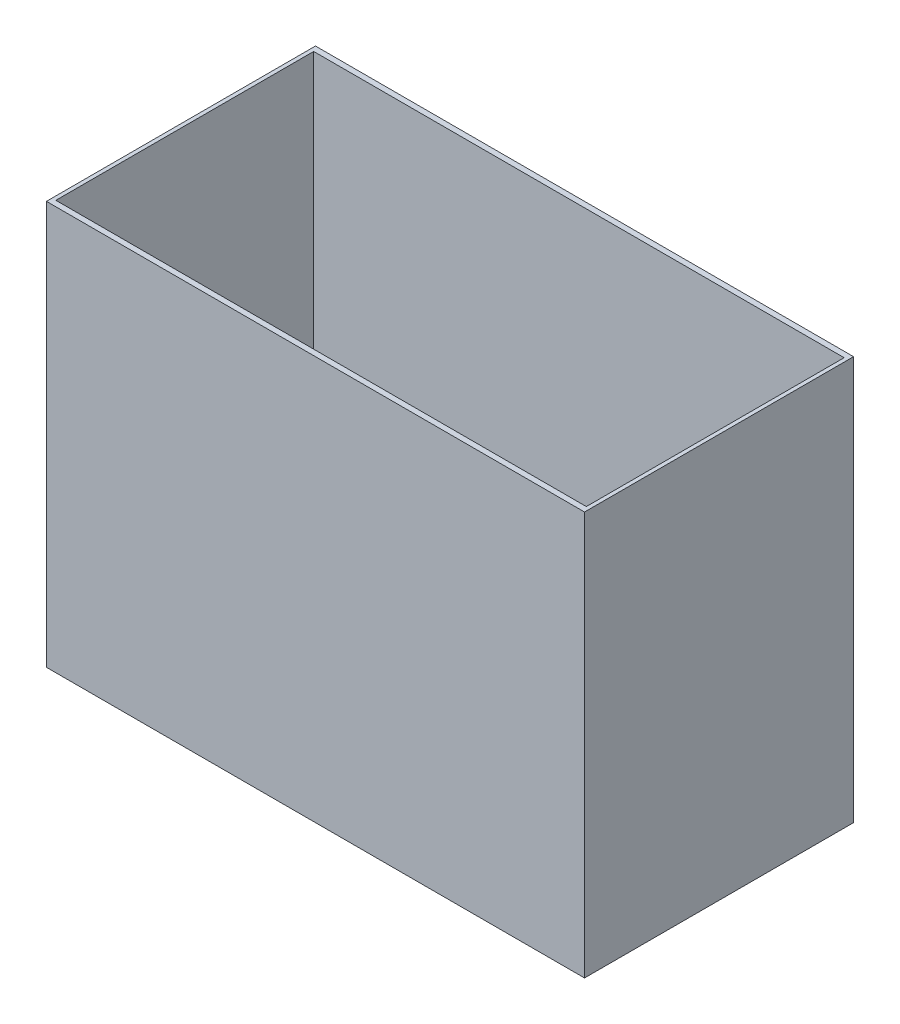
ISO-10303-21;
HEADER;
FILE_DESCRIPTION(('STEP AP214'),'2;1');
FILE_NAME('part.step','',(''),(''),'','','');
FILE_SCHEMA(('AUTOMOTIVE_DESIGN { 1 0 10303 214 1 1 1 1 }'));
ENDSEC;
DATA;
#1=APPLICATION_CONTEXT('core data for automotive mechanical design processes');
#2=APPLICATION_PROTOCOL_DEFINITION('international standard','automotive_design',2000,#1);
#3=PRODUCT_CONTEXT('',#1,'mechanical');
#4=PRODUCT('Part','Part','',(#3));
#5=PRODUCT_RELATED_PRODUCT_CATEGORY('part','',(#4));
#6=PRODUCT_DEFINITION_FORMATION('','',#4);
#7=PRODUCT_DEFINITION_CONTEXT('part definition',#1,'design');
#8=PRODUCT_DEFINITION('design','',#6,#7);
#9=PRODUCT_DEFINITION_SHAPE('','',#8);
#10=(LENGTH_UNIT() NAMED_UNIT(*) SI_UNIT(.MILLI.,.METRE.));
#11=(NAMED_UNIT(*) PLANE_ANGLE_UNIT() SI_UNIT($,.RADIAN.));
#12=(NAMED_UNIT(*) SI_UNIT($,.STERADIAN.) SOLID_ANGLE_UNIT());
#13=UNCERTAINTY_MEASURE_WITH_UNIT(LENGTH_MEASURE(1.E-05),#10,'distance_accuracy_value','');
#14=(GEOMETRIC_REPRESENTATION_CONTEXT(3) GLOBAL_UNCERTAINTY_ASSIGNED_CONTEXT((#13)) GLOBAL_UNIT_ASSIGNED_CONTEXT((#10,
#11,#12)) REPRESENTATION_CONTEXT('',''));
#15=CARTESIAN_POINT('',(0.,0.,0.));
#16=DIRECTION('',(0.,0.,1.));
#17=DIRECTION('',(1.,0.,0.));
#18=AXIS2_PLACEMENT_3D('',#15,#16,#17);
#19=CARTESIAN_POINT('',(0.,457.2,0.));
#20=DIRECTION('',(0.,-1.,0.));
#21=DIRECTION('',(0.,0.,-1.));
#22=AXIS2_PLACEMENT_3D('',#19,#20,#21);
#23=PLANE('',#22);
#24=DIRECTION('',(0.,0.,-1.));
#25=VECTOR('',#24,1.);
#26=CARTESIAN_POINT('',(304.8,457.2,152.4));
#27=LINE('',#26,#25);
#28=CARTESIAN_POINT('',(304.8,457.2,152.4));
#29=VERTEX_POINT('',#28);
#30=CARTESIAN_POINT('',(304.8,457.2,-152.4));
#31=VERTEX_POINT('',#30);
#32=EDGE_CURVE('E151',#29,#31,#27,.T.);
#33=ORIENTED_EDGE('',*,*,#32,.T.);
#34=DIRECTION('',(-1.,0.,0.));
#35=VECTOR('',#34,1.);
#36=CARTESIAN_POINT('',(-304.8,457.2,-152.4));
#37=LINE('',#36,#35);
#38=CARTESIAN_POINT('',(-304.8,457.2,-152.4));
#39=VERTEX_POINT('',#38);
#40=EDGE_CURVE('E154',#31,#39,#37,.T.);
#41=ORIENTED_EDGE('',*,*,#40,.T.);
#42=DIRECTION('',(0.,0.,1.));
#43=VECTOR('',#42,1.);
#44=CARTESIAN_POINT('',(-304.8,457.2,152.4));
#45=LINE('',#44,#43);
#46=CARTESIAN_POINT('',(-304.8,457.2,152.4));
#47=VERTEX_POINT('',#46);
#48=EDGE_CURVE('E157',#39,#47,#45,.T.);
#49=ORIENTED_EDGE('',*,*,#48,.T.);
#50=DIRECTION('',(1.,0.,0.));
#51=VECTOR('',#50,1.);
#52=CARTESIAN_POINT('',(-304.8,457.2,152.4));
#53=LINE('',#52,#51);
#54=EDGE_CURVE('E159',#47,#29,#53,.T.);
#55=ORIENTED_EDGE('',*,*,#54,.T.);
#56=EDGE_LOOP('',(#33,#41,#49,#55));
#57=FACE_BOUND('',#56,.T.);
#58=DIRECTION('',(0.,0.,-1.));
#59=VECTOR('',#58,1.);
#60=CARTESIAN_POINT('',(300.482,457.2,146.05));
#61=LINE('',#60,#59);
#62=CARTESIAN_POINT('',(300.482,457.2,146.05));
#63=VERTEX_POINT('',#62);
#64=CARTESIAN_POINT('',(300.482,457.2,-146.05));
#65=VERTEX_POINT('',#64);
#66=EDGE_CURVE('E115',#63,#65,#61,.T.);
#67=ORIENTED_EDGE('',*,*,#66,.F.);
#68=DIRECTION('',(1.,0.,0.));
#69=VECTOR('',#68,1.);
#70=CARTESIAN_POINT('',(-300.482,457.2,146.05));
#71=LINE('',#70,#69);
#72=CARTESIAN_POINT('',(-300.482,457.2,146.05));
#73=VERTEX_POINT('',#72);
#74=EDGE_CURVE('E137',#73,#63,#71,.T.);
#75=ORIENTED_EDGE('',*,*,#74,.F.);
#76=DIRECTION('',(0.,0.,1.));
#77=VECTOR('',#76,1.);
#78=CARTESIAN_POINT('',(-300.482,457.2,146.05));
#79=LINE('',#78,#77);
#80=CARTESIAN_POINT('',(-300.482,457.2,-146.05));
#81=VERTEX_POINT('',#80);
#82=EDGE_CURVE('E135',#81,#73,#79,.T.);
#83=ORIENTED_EDGE('',*,*,#82,.F.);
#84=DIRECTION('',(-1.,0.,0.));
#85=VECTOR('',#84,1.);
#86=CARTESIAN_POINT('',(-300.482,457.2,-146.05));
#87=LINE('',#86,#85);
#88=EDGE_CURVE('E123',#65,#81,#87,.T.);
#89=ORIENTED_EDGE('',*,*,#88,.F.);
#90=EDGE_LOOP('',(#67,#75,#83,#89));
#91=FACE_BOUND('',#90,.T.);
#92=ADVANCED_FACE('F50',(#57,#91),#23,.F.);
#93=CARTESIAN_POINT('',(0.,0.,0.));
#94=DIRECTION('',(0.,-1.,0.));
#95=DIRECTION('',(0.,0.,-1.));
#96=AXIS2_PLACEMENT_3D('',#93,#94,#95);
#97=PLANE('',#96);
#98=DIRECTION('',(0.,0.,-1.));
#99=VECTOR('',#98,1.);
#100=CARTESIAN_POINT('',(304.8,0.,152.4));
#101=LINE('',#100,#99);
#102=CARTESIAN_POINT('',(304.8,0.,152.4));
#103=VERTEX_POINT('',#102);
#104=CARTESIAN_POINT('',(304.8,0.,-152.4));
#105=VERTEX_POINT('',#104);
#106=EDGE_CURVE('E131',#103,#105,#101,.T.);
#107=ORIENTED_EDGE('',*,*,#106,.F.);
#108=DIRECTION('',(1.,0.,0.));
#109=VECTOR('',#108,1.);
#110=CARTESIAN_POINT('',(-304.8,0.,152.4));
#111=LINE('',#110,#109);
#112=CARTESIAN_POINT('',(-304.8,0.,152.4));
#113=VERTEX_POINT('',#112);
#114=EDGE_CURVE('E155',#113,#103,#111,.T.);
#115=ORIENTED_EDGE('',*,*,#114,.F.);
#116=DIRECTION('',(0.,0.,1.));
#117=VECTOR('',#116,1.);
#118=CARTESIAN_POINT('',(-304.8,0.,152.4));
#119=LINE('',#118,#117);
#120=CARTESIAN_POINT('',(-304.8,0.,-152.4));
#121=VERTEX_POINT('',#120);
#122=EDGE_CURVE('E166',#121,#113,#119,.T.);
#123=ORIENTED_EDGE('',*,*,#122,.F.);
#124=DIRECTION('',(-1.,0.,0.));
#125=VECTOR('',#124,1.);
#126=CARTESIAN_POINT('',(-304.8,0.,-152.4));
#127=LINE('',#126,#125);
#128=EDGE_CURVE('E164',#105,#121,#127,.T.);
#129=ORIENTED_EDGE('',*,*,#128,.F.);
#130=EDGE_LOOP('',(#107,#115,#123,#129));
#131=FACE_BOUND('',#130,.T.);
#132=DIRECTION('',(1.,0.,0.));
#133=VECTOR('',#132,1.);
#134=CARTESIAN_POINT('',(-300.482,0.,146.05));
#135=LINE('',#134,#133);
#136=CARTESIAN_POINT('',(-300.482,0.,146.05));
#137=VERTEX_POINT('',#136);
#138=CARTESIAN_POINT('',(300.482,0.,146.05));
#139=VERTEX_POINT('',#138);
#140=EDGE_CURVE('E124',#137,#139,#135,.T.);
#141=ORIENTED_EDGE('',*,*,#140,.T.);
#142=DIRECTION('',(0.,0.,-1.));
#143=VECTOR('',#142,1.);
#144=CARTESIAN_POINT('',(300.482,0.,146.05));
#145=LINE('',#144,#143);
#146=CARTESIAN_POINT('',(300.482,0.,-146.05));
#147=VERTEX_POINT('',#146);
#148=EDGE_CURVE('E73',#139,#147,#145,.T.);
#149=ORIENTED_EDGE('',*,*,#148,.T.);
#150=DIRECTION('',(-1.,0.,0.));
#151=VECTOR('',#150,1.);
#152=CARTESIAN_POINT('',(-300.482,0.,-146.05));
#153=LINE('',#152,#151);
#154=CARTESIAN_POINT('',(-300.482,0.,-146.05));
#155=VERTEX_POINT('',#154);
#156=EDGE_CURVE('E130',#147,#155,#153,.T.);
#157=ORIENTED_EDGE('',*,*,#156,.T.);
#158=DIRECTION('',(0.,0.,1.));
#159=VECTOR('',#158,1.);
#160=CARTESIAN_POINT('',(-300.482,0.,146.05));
#161=LINE('',#160,#159);
#162=EDGE_CURVE('E143',#155,#137,#161,.T.);
#163=ORIENTED_EDGE('',*,*,#162,.T.);
#164=EDGE_LOOP('',(#141,#149,#157,#163));
#165=FACE_BOUND('',#164,.T.);
#166=ADVANCED_FACE('F184',(#131,#165),#97,.T.);
#167=CARTESIAN_POINT('',(304.8,457.2,152.4));
#168=DIRECTION('',(-1.,0.,0.));
#169=DIRECTION('',(0.,0.,1.));
#170=AXIS2_PLACEMENT_3D('',#167,#168,#169);
#171=PLANE('',#170);
#172=ORIENTED_EDGE('',*,*,#106,.T.);
#173=DIRECTION('',(0.,-1.,0.));
#174=VECTOR('',#173,1.);
#175=CARTESIAN_POINT('',(304.8,457.2,-152.4));
#176=LINE('',#175,#174);
#177=EDGE_CURVE('E12',#31,#105,#176,.T.);
#178=ORIENTED_EDGE('',*,*,#177,.F.);
#179=ORIENTED_EDGE('',*,*,#32,.F.);
#180=DIRECTION('',(0.,-1.,0.));
#181=VECTOR('',#180,1.);
#182=CARTESIAN_POINT('',(304.8,457.2,152.4));
#183=LINE('',#182,#181);
#184=EDGE_CURVE('E161',#29,#103,#183,.T.);
#185=ORIENTED_EDGE('',*,*,#184,.T.);
#186=EDGE_LOOP('',(#172,#178,#179,#185));
#187=FACE_BOUND('',#186,.T.);
#188=ADVANCED_FACE('F52',(#187),#171,.F.);
#189=CARTESIAN_POINT('',(-304.8,457.2,-152.4));
#190=DIRECTION('',(0.,0.,1.));
#191=DIRECTION('',(1.,0.,0.));
#192=AXIS2_PLACEMENT_3D('',#189,#190,#191);
#193=PLANE('',#192);
#194=ORIENTED_EDGE('',*,*,#128,.T.);
#195=DIRECTION('',(0.,-1.,0.));
#196=VECTOR('',#195,1.);
#197=CARTESIAN_POINT('',(-304.8,457.2,-152.4));
#198=LINE('',#197,#196);
#199=EDGE_CURVE('E58',#39,#121,#198,.T.);
#200=ORIENTED_EDGE('',*,*,#199,.F.);
#201=ORIENTED_EDGE('',*,*,#40,.F.);
#202=ORIENTED_EDGE('',*,*,#177,.T.);
#203=EDGE_LOOP('',(#194,#200,#201,#202));
#204=FACE_BOUND('',#203,.T.);
#205=ADVANCED_FACE('F194',(#204),#193,.F.);
#206=CARTESIAN_POINT('',(-304.8,457.2,152.4));
#207=DIRECTION('',(1.,0.,0.));
#208=DIRECTION('',(0.,0.,-1.));
#209=AXIS2_PLACEMENT_3D('',#206,#207,#208);
#210=PLANE('',#209);
#211=ORIENTED_EDGE('',*,*,#122,.T.);
#212=DIRECTION('',(0.,-1.,0.));
#213=VECTOR('',#212,1.);
#214=CARTESIAN_POINT('',(-304.8,457.2,152.4));
#215=LINE('',#214,#213);
#216=EDGE_CURVE('E171',#47,#113,#215,.T.);
#217=ORIENTED_EDGE('',*,*,#216,.F.);
#218=ORIENTED_EDGE('',*,*,#48,.F.);
#219=ORIENTED_EDGE('',*,*,#199,.T.);
#220=EDGE_LOOP('',(#211,#217,#218,#219));
#221=FACE_BOUND('',#220,.T.);
#222=ADVANCED_FACE('F178',(#221),#210,.F.);
#223=CARTESIAN_POINT('',(-304.8,457.2,152.4));
#224=DIRECTION('',(0.,0.,-1.));
#225=DIRECTION('',(-1.,0.,0.));
#226=AXIS2_PLACEMENT_3D('',#223,#224,#225);
#227=PLANE('',#226);
#228=ORIENTED_EDGE('',*,*,#114,.T.);
#229=ORIENTED_EDGE('',*,*,#184,.F.);
#230=ORIENTED_EDGE('',*,*,#54,.F.);
#231=ORIENTED_EDGE('',*,*,#216,.T.);
#232=EDGE_LOOP('',(#228,#229,#230,#231));
#233=FACE_BOUND('',#232,.T.);
#234=ADVANCED_FACE('F188',(#233),#227,.F.);
#235=CARTESIAN_POINT('',(300.482,457.2,146.05));
#236=DIRECTION('',(-1.,0.,0.));
#237=DIRECTION('',(0.,0.,1.));
#238=AXIS2_PLACEMENT_3D('',#235,#236,#237);
#239=PLANE('',#238);
#240=ORIENTED_EDGE('',*,*,#148,.F.);
#241=DIRECTION('',(0.,-1.,0.));
#242=VECTOR('',#241,1.);
#243=CARTESIAN_POINT('',(300.482,457.2,146.05));
#244=LINE('',#243,#242);
#245=EDGE_CURVE('E119',#63,#139,#244,.T.);
#246=ORIENTED_EDGE('',*,*,#245,.F.);
#247=ORIENTED_EDGE('',*,*,#66,.T.);
#248=DIRECTION('',(0.,-1.,0.));
#249=VECTOR('',#248,1.);
#250=CARTESIAN_POINT('',(300.482,457.2,-146.05));
#251=LINE('',#250,#249);
#252=EDGE_CURVE('E118',#65,#147,#251,.T.);
#253=ORIENTED_EDGE('',*,*,#252,.T.);
#254=EDGE_LOOP('',(#240,#246,#247,#253));
#255=FACE_BOUND('',#254,.T.);
#256=ADVANCED_FACE('F117',(#255),#239,.T.);
#257=CARTESIAN_POINT('',(-300.482,457.2,-146.05));
#258=DIRECTION('',(0.,0.,1.));
#259=DIRECTION('',(1.,0.,0.));
#260=AXIS2_PLACEMENT_3D('',#257,#258,#259);
#261=PLANE('',#260);
#262=ORIENTED_EDGE('',*,*,#156,.F.);
#263=ORIENTED_EDGE('',*,*,#252,.F.);
#264=ORIENTED_EDGE('',*,*,#88,.T.);
#265=DIRECTION('',(0.,-1.,0.));
#266=VECTOR('',#265,1.);
#267=CARTESIAN_POINT('',(-300.482,457.2,-146.05));
#268=LINE('',#267,#266);
#269=EDGE_CURVE('E132',#81,#155,#268,.T.);
#270=ORIENTED_EDGE('',*,*,#269,.T.);
#271=EDGE_LOOP('',(#262,#263,#264,#270));
#272=FACE_BOUND('',#271,.T.);
#273=ADVANCED_FACE('F127',(#272),#261,.T.);
#274=CARTESIAN_POINT('',(-300.482,457.2,146.05));
#275=DIRECTION('',(1.,0.,0.));
#276=DIRECTION('',(0.,0.,-1.));
#277=AXIS2_PLACEMENT_3D('',#274,#275,#276);
#278=PLANE('',#277);
#279=ORIENTED_EDGE('',*,*,#162,.F.);
#280=ORIENTED_EDGE('',*,*,#269,.F.);
#281=ORIENTED_EDGE('',*,*,#82,.T.);
#282=DIRECTION('',(0.,-1.,0.));
#283=VECTOR('',#282,1.);
#284=CARTESIAN_POINT('',(-300.482,457.2,146.05));
#285=LINE('',#284,#283);
#286=EDGE_CURVE('E65',#73,#137,#285,.T.);
#287=ORIENTED_EDGE('',*,*,#286,.T.);
#288=EDGE_LOOP('',(#279,#280,#281,#287));
#289=FACE_BOUND('',#288,.T.);
#290=ADVANCED_FACE('F217',(#289),#278,.T.);
#291=CARTESIAN_POINT('',(-300.482,457.2,146.05));
#292=DIRECTION('',(0.,0.,-1.));
#293=DIRECTION('',(-1.,0.,0.));
#294=AXIS2_PLACEMENT_3D('',#291,#292,#293);
#295=PLANE('',#294);
#296=ORIENTED_EDGE('',*,*,#140,.F.);
#297=ORIENTED_EDGE('',*,*,#286,.F.);
#298=ORIENTED_EDGE('',*,*,#74,.T.);
#299=ORIENTED_EDGE('',*,*,#245,.T.);
#300=EDGE_LOOP('',(#296,#297,#298,#299));
#301=FACE_BOUND('',#300,.T.);
#302=ADVANCED_FACE('F221',(#301),#295,.T.);
#303=CLOSED_SHELL('',(#92,#166,#188,#205,#222,#234,#256,#273,#290,#302));
#304=MANIFOLD_SOLID_BREP('B2_NOT_SHOWN',#303);
#305=CARTESIAN_POINT('',(-292.1,12.7,-139.7));
#306=DIRECTION('',(1.,0.,0.));
#307=DIRECTION('',(0.,0.,-1.));
#308=AXIS2_PLACEMENT_3D('',#305,#306,#307);
#309=PLANE('',#308);
#310=DIRECTION('',(0.,0.,1.));
#311=VECTOR('',#310,1.);
#312=CARTESIAN_POINT('',(-292.1,0.,-139.7));
#313=LINE('',#312,#311);
#314=CARTESIAN_POINT('',(-292.1,0.,-139.7));
#315=VERTEX_POINT('',#314);
#316=CARTESIAN_POINT('',(-292.1,0.,139.7));
#317=VERTEX_POINT('',#316);
#318=EDGE_CURVE('E343',#315,#317,#313,.T.);
#319=ORIENTED_EDGE('',*,*,#318,.T.);
#320=DIRECTION('',(0.,-1.,0.));
#321=VECTOR('',#320,1.);
#322=CARTESIAN_POINT('',(-292.1,12.7,139.7));
#323=LINE('',#322,#321);
#324=CARTESIAN_POINT('',(-292.1,12.7,139.7));
#325=VERTEX_POINT('',#324);
#326=EDGE_CURVE('E48',#325,#317,#323,.T.);
#327=ORIENTED_EDGE('',*,*,#326,.F.);
#328=DIRECTION('',(0.,0.,1.));
#329=VECTOR('',#328,1.);
#330=CARTESIAN_POINT('',(-292.1,12.7,-139.7));
#331=LINE('',#330,#329);
#332=CARTESIAN_POINT('',(-292.1,12.7,-139.7));
#333=VERTEX_POINT('',#332);
#334=EDGE_CURVE('E331',#333,#325,#331,.T.);
#335=ORIENTED_EDGE('',*,*,#334,.F.);
#336=DIRECTION('',(0.,-1.,0.));
#337=VECTOR('',#336,1.);
#338=CARTESIAN_POINT('',(-292.1,12.7,-139.7));
#339=LINE('',#338,#337);
#340=EDGE_CURVE('E339',#333,#315,#339,.T.);
#341=ORIENTED_EDGE('',*,*,#340,.T.);
#342=EDGE_LOOP('',(#319,#327,#335,#341));
#343=FACE_BOUND('',#342,.T.);
#344=ADVANCED_FACE('F280',(#343),#309,.F.);
#345=CARTESIAN_POINT('',(-292.1,12.7,139.7));
#346=DIRECTION('',(0.,0.,-1.));
#347=DIRECTION('',(-1.,0.,0.));
#348=AXIS2_PLACEMENT_3D('',#345,#346,#347);
#349=PLANE('',#348);
#350=DIRECTION('',(1.,0.,0.));
#351=VECTOR('',#350,1.);
#352=CARTESIAN_POINT('',(-292.1,0.,139.7));
#353=LINE('',#352,#351);
#354=CARTESIAN_POINT('',(292.1,0.,139.7));
#355=VERTEX_POINT('',#354);
#356=EDGE_CURVE('E335',#317,#355,#353,.T.);
#357=ORIENTED_EDGE('',*,*,#356,.T.);
#358=DIRECTION('',(0.,-1.,0.));
#359=VECTOR('',#358,1.);
#360=CARTESIAN_POINT('',(292.1,12.7,139.7));
#361=LINE('',#360,#359);
#362=CARTESIAN_POINT('',(292.1,12.7,139.7));
#363=VERTEX_POINT('',#362);
#364=EDGE_CURVE('E288',#363,#355,#361,.T.);
#365=ORIENTED_EDGE('',*,*,#364,.F.);
#366=DIRECTION('',(1.,0.,0.));
#367=VECTOR('',#366,1.);
#368=CARTESIAN_POINT('',(-292.1,12.7,139.7));
#369=LINE('',#368,#367);
#370=EDGE_CURVE('E326',#325,#363,#369,.T.);
#371=ORIENTED_EDGE('',*,*,#370,.F.);
#372=ORIENTED_EDGE('',*,*,#326,.T.);
#373=EDGE_LOOP('',(#357,#365,#371,#372));
#374=FACE_BOUND('',#373,.T.);
#375=ADVANCED_FACE('F334',(#374),#349,.F.);
#376=CARTESIAN_POINT('',(292.1,12.7,-139.7));
#377=DIRECTION('',(-1.,0.,0.));
#378=DIRECTION('',(0.,0.,1.));
#379=AXIS2_PLACEMENT_3D('',#376,#377,#378);
#380=PLANE('',#379);
#381=DIRECTION('',(0.,0.,-1.));
#382=VECTOR('',#381,1.);
#383=CARTESIAN_POINT('',(292.1,0.,-139.7));
#384=LINE('',#383,#382);
#385=CARTESIAN_POINT('',(292.1,0.,-139.7));
#386=VERTEX_POINT('',#385);
#387=EDGE_CURVE('E313',#355,#386,#384,.T.);
#388=ORIENTED_EDGE('',*,*,#387,.T.);
#389=DIRECTION('',(0.,-1.,0.));
#390=VECTOR('',#389,1.);
#391=CARTESIAN_POINT('',(292.1,12.7,-139.7));
#392=LINE('',#391,#390);
#393=CARTESIAN_POINT('',(292.1,12.7,-139.7));
#394=VERTEX_POINT('',#393);
#395=EDGE_CURVE('E336',#394,#386,#392,.T.);
#396=ORIENTED_EDGE('',*,*,#395,.F.);
#397=DIRECTION('',(0.,0.,-1.));
#398=VECTOR('',#397,1.);
#399=CARTESIAN_POINT('',(292.1,12.7,-139.7));
#400=LINE('',#399,#398);
#401=EDGE_CURVE('E329',#363,#394,#400,.T.);
#402=ORIENTED_EDGE('',*,*,#401,.F.);
#403=ORIENTED_EDGE('',*,*,#364,.T.);
#404=EDGE_LOOP('',(#388,#396,#402,#403));
#405=FACE_BOUND('',#404,.T.);
#406=ADVANCED_FACE('F337',(#405),#380,.F.);
#407=CARTESIAN_POINT('',(-292.1,12.7,-139.7));
#408=DIRECTION('',(0.,0.,1.));
#409=DIRECTION('',(1.,0.,0.));
#410=AXIS2_PLACEMENT_3D('',#407,#408,#409);
#411=PLANE('',#410);
#412=DIRECTION('',(-1.,0.,0.));
#413=VECTOR('',#412,1.);
#414=CARTESIAN_POINT('',(-292.1,0.,-139.7));
#415=LINE('',#414,#413);
#416=EDGE_CURVE('E319',#386,#315,#415,.T.);
#417=ORIENTED_EDGE('',*,*,#416,.T.);
#418=ORIENTED_EDGE('',*,*,#340,.F.);
#419=DIRECTION('',(-1.,0.,0.));
#420=VECTOR('',#419,1.);
#421=CARTESIAN_POINT('',(-292.1,12.7,-139.7));
#422=LINE('',#421,#420);
#423=EDGE_CURVE('E296',#394,#333,#422,.T.);
#424=ORIENTED_EDGE('',*,*,#423,.F.);
#425=ORIENTED_EDGE('',*,*,#395,.T.);
#426=EDGE_LOOP('',(#417,#418,#424,#425));
#427=FACE_BOUND('',#426,.T.);
#428=ADVANCED_FACE('F351',(#427),#411,.F.);
#429=CARTESIAN_POINT('',(0.,12.7,0.));
#430=DIRECTION('',(0.,1.,0.));
#431=DIRECTION('',(0.,0.,1.));
#432=AXIS2_PLACEMENT_3D('',#429,#430,#431);
#433=PLANE('',#432);
#434=CARTESIAN_POINT('',(254.,12.7,101.6));
#435=DIRECTION('',(0.,-1.,0.));
#436=DIRECTION('',(0.,0.,-1.));
#437=AXIS2_PLACEMENT_3D('',#434,#435,#436);
#438=CIRCLE('',#437,2.77812500000002);
#439=CARTESIAN_POINT('',(254.,12.7,98.821875));
#440=VERTEX_POINT('',#439);
#441=EDGE_CURVE('E363',#440,#440,#438,.T.);
#442=ORIENTED_EDGE('',*,*,#441,.T.);
#443=EDGE_LOOP('',(#442));
#444=FACE_BOUND('',#443,.T.);
#445=CARTESIAN_POINT('',(254.,12.7,-101.6));
#446=DIRECTION('',(0.,1.,0.));
#447=DIRECTION('',(0.,0.,1.));
#448=AXIS2_PLACEMENT_3D('',#445,#446,#447);
#449=CIRCLE('',#448,2.77812500000002);
#450=CARTESIAN_POINT('',(254.,12.7,-98.821875));
#451=VERTEX_POINT('',#450);
#452=EDGE_CURVE('E357',#451,#451,#449,.T.);
#453=ORIENTED_EDGE('',*,*,#452,.F.);
#454=EDGE_LOOP('',(#453));
#455=FACE_BOUND('',#454,.T.);
#456=ORIENTED_EDGE('',*,*,#334,.T.);
#457=ORIENTED_EDGE('',*,*,#370,.T.);
#458=ORIENTED_EDGE('',*,*,#401,.T.);
#459=ORIENTED_EDGE('',*,*,#423,.T.);
#460=EDGE_LOOP('',(#456,#457,#458,#459));
#461=FACE_BOUND('',#460,.T.);
#462=ADVANCED_FACE('F327',(#444,#455,#461),#433,.T.);
#463=CARTESIAN_POINT('',(0.,0.,0.));
#464=DIRECTION('',(0.,1.,0.));
#465=DIRECTION('',(0.,0.,1.));
#466=AXIS2_PLACEMENT_3D('',#463,#464,#465);
#467=PLANE('',#466);
#468=CARTESIAN_POINT('',(254.,0.,101.6));
#469=DIRECTION('',(0.,-1.,0.));
#470=DIRECTION('',(0.,0.,-1.));
#471=AXIS2_PLACEMENT_3D('',#468,#469,#470);
#472=CIRCLE('',#471,2.77812500000002);
#473=CARTESIAN_POINT('',(254.,0.,98.821875));
#474=VERTEX_POINT('',#473);
#475=EDGE_CURVE('E360',#474,#474,#472,.T.);
#476=ORIENTED_EDGE('',*,*,#475,.F.);
#477=EDGE_LOOP('',(#476));
#478=FACE_BOUND('',#477,.T.);
#479=CARTESIAN_POINT('',(254.,0.,-101.6));
#480=DIRECTION('',(0.,1.,0.));
#481=DIRECTION('',(0.,0.,1.));
#482=AXIS2_PLACEMENT_3D('',#479,#480,#481);
#483=CIRCLE('',#482,2.77812500000002);
#484=CARTESIAN_POINT('',(254.,0.,-98.821875));
#485=VERTEX_POINT('',#484);
#486=EDGE_CURVE('E346',#485,#485,#483,.T.);
#487=ORIENTED_EDGE('',*,*,#486,.T.);
#488=EDGE_LOOP('',(#487));
#489=FACE_BOUND('',#488,.T.);
#490=ORIENTED_EDGE('',*,*,#318,.F.);
#491=ORIENTED_EDGE('',*,*,#416,.F.);
#492=ORIENTED_EDGE('',*,*,#387,.F.);
#493=ORIENTED_EDGE('',*,*,#356,.F.);
#494=EDGE_LOOP('',(#490,#491,#492,#493));
#495=FACE_BOUND('',#494,.T.);
#496=ADVANCED_FACE('F354',(#478,#489,#495),#467,.F.);
#497=CARTESIAN_POINT('',(254.,0.,-101.6));
#498=DIRECTION('',(0.,1.,0.));
#499=DIRECTION('',(0.,0.,1.));
#500=AXIS2_PLACEMENT_3D('',#497,#498,#499);
#501=CYLINDRICAL_SURFACE('',#500,2.77812500000002);
#502=ORIENTED_EDGE('',*,*,#486,.F.);
#503=EDGE_LOOP('',(#502));
#504=FACE_BOUND('',#503,.T.);
#505=ORIENTED_EDGE('',*,*,#452,.T.);
#506=EDGE_LOOP('',(#505));
#507=FACE_BOUND('',#506,.T.);
#508=ADVANCED_FACE('F374',(#504,#507),#501,.F.);
#509=CARTESIAN_POINT('',(254.,0.,101.6));
#510=DIRECTION('',(0.,1.,0.));
#511=DIRECTION('',(0.,0.,1.));
#512=AXIS2_PLACEMENT_3D('',#509,#510,#511);
#513=CYLINDRICAL_SURFACE('',#512,2.77812500000002);
#514=ORIENTED_EDGE('',*,*,#475,.T.);
#515=EDGE_LOOP('',(#514));
#516=FACE_BOUND('',#515,.T.);
#517=ORIENTED_EDGE('',*,*,#441,.F.);
#518=EDGE_LOOP('',(#517));
#519=FACE_BOUND('',#518,.T.);
#520=ADVANCED_FACE('F369',(#516,#519),#513,.F.);
#521=CLOSED_SHELL('',(#344,#375,#406,#428,#462,#496,#508,#520));
#522=MANIFOLD_SOLID_BREP('B6',#521);
#523=ADVANCED_BREP_SHAPE_REPRESENTATION('',(#18,#304,#522),#14);
#524=SHAPE_DEFINITION_REPRESENTATION(#9,#523);
ENDSEC;
END-ISO-10303-21;
